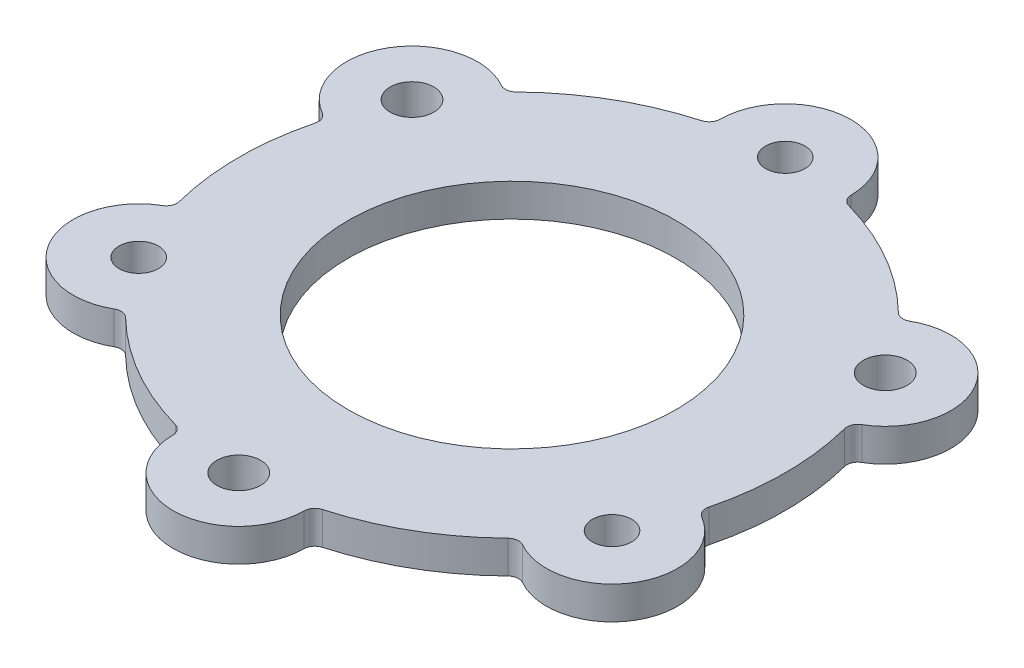
ISO-10303-21;
HEADER;
FILE_DESCRIPTION(('STEP AP214'),'2;1');
FILE_NAME('part.step','',(''),(''),'','','');
FILE_SCHEMA(('AUTOMOTIVE_DESIGN { 1 0 10303 214 1 1 1 1 }'));
ENDSEC;
DATA;
#1=APPLICATION_CONTEXT('core data for automotive mechanical design processes');
#2=APPLICATION_PROTOCOL_DEFINITION('international standard','automotive_design',2000,#1);
#3=PRODUCT_CONTEXT('',#1,'mechanical');
#4=PRODUCT('Part','Part','',(#3));
#5=PRODUCT_RELATED_PRODUCT_CATEGORY('part','',(#4));
#6=PRODUCT_DEFINITION_FORMATION('','',#4);
#7=PRODUCT_DEFINITION_CONTEXT('part definition',#1,'design');
#8=PRODUCT_DEFINITION('design','',#6,#7);
#9=PRODUCT_DEFINITION_SHAPE('','',#8);
#10=(LENGTH_UNIT() NAMED_UNIT(*) SI_UNIT(.MILLI.,.METRE.));
#11=(NAMED_UNIT(*) PLANE_ANGLE_UNIT() SI_UNIT($,.RADIAN.));
#12=(NAMED_UNIT(*) SI_UNIT($,.STERADIAN.) SOLID_ANGLE_UNIT());
#13=UNCERTAINTY_MEASURE_WITH_UNIT(LENGTH_MEASURE(1.E-05),#10,'distance_accuracy_value','');
#14=(GEOMETRIC_REPRESENTATION_CONTEXT(3) GLOBAL_UNCERTAINTY_ASSIGNED_CONTEXT((#13)) GLOBAL_UNIT_ASSIGNED_CONTEXT((#10,
#11,#12)) REPRESENTATION_CONTEXT('',''));
#15=CARTESIAN_POINT('',(0.,0.,0.));
#16=DIRECTION('',(0.,0.,1.));
#17=DIRECTION('',(1.,0.,0.));
#18=AXIS2_PLACEMENT_3D('',#15,#16,#17);
#19=CARTESIAN_POINT('',(0.,1.5,0.));
#20=DIRECTION('',(0.,-1.,0.));
#21=DIRECTION('',(0.,0.,-1.));
#22=AXIS2_PLACEMENT_3D('',#19,#20,#21);
#23=CYLINDRICAL_SURFACE('',#22,12.5);
#24=CARTESIAN_POINT('',(0.,1.5,0.));
#25=DIRECTION('',(0.,1.,0.));
#26=DIRECTION('',(0.,0.,1.));
#27=AXIS2_PLACEMENT_3D('',#24,#25,#26);
#28=CIRCLE('',#27,12.5);
#29=CARTESIAN_POINT('',(-3.36532966988113,1.5,-12.0384615384615));
#30=VERTEX_POINT('',#29);
#31=CARTESIAN_POINT('',(-8.74294867984902,1.5,-8.93369175545733));
#32=VERTEX_POINT('',#31);
#33=EDGE_CURVE('E502',#30,#32,#28,.T.);
#34=ORIENTED_EDGE('',*,*,#33,.F.);
#35=DIRECTION('',(0.,-1.,0.));
#36=VECTOR('',#35,1.);
#37=CARTESIAN_POINT('',(-3.36532966988113,1.5,-12.0384615384615));
#38=LINE('',#37,#36);
#39=CARTESIAN_POINT('',(-3.36532966988113,0.,-12.0384615384615));
#40=VERTEX_POINT('',#39);
#41=EDGE_CURVE('E305',#30,#40,#38,.T.);
#42=ORIENTED_EDGE('',*,*,#41,.T.);
#43=CARTESIAN_POINT('',(0.,0.,0.));
#44=DIRECTION('',(0.,1.,0.));
#45=DIRECTION('',(0.,0.,1.));
#46=AXIS2_PLACEMENT_3D('',#43,#44,#45);
#47=CIRCLE('',#46,12.5);
#48=CARTESIAN_POINT('',(-8.74294867984902,0.,-8.93369175545733));
#49=VERTEX_POINT('',#48);
#50=EDGE_CURVE('E418',#40,#49,#47,.T.);
#51=ORIENTED_EDGE('',*,*,#50,.T.);
#52=DIRECTION('',(0.,-1.,0.));
#53=VECTOR('',#52,1.);
#54=CARTESIAN_POINT('',(-8.74294867984902,1.5,-8.93369175545733));
#55=LINE('',#54,#53);
#56=EDGE_CURVE('E303',#49,#32,#55,.F.);
#57=ORIENTED_EDGE('',*,*,#56,.T.);
#58=EDGE_LOOP('',(#34,#42,#51,#57));
#59=FACE_BOUND('',#58,.T.);
#60=ADVANCED_FACE('F34',(#59),#23,.T.);
#61=CARTESIAN_POINT('',(-10.8253175473055,1.5,-6.25000000000001));
#62=DIRECTION('',(0.,-1.,0.));
#63=DIRECTION('',(0.,0.,-1.));
#64=AXIS2_PLACEMENT_3D('',#61,#62,#63);
#65=CYLINDRICAL_SURFACE('',#64,3.);
#66=CARTESIAN_POINT('',(-10.8253175473055,1.5,-6.25000000000001));
#67=DIRECTION('',(0.,1.,0.));
#68=DIRECTION('',(0.,0.,1.));
#69=AXIS2_PLACEMENT_3D('',#66,#67,#68);
#70=CIRCLE('',#69,3.);
#71=CARTESIAN_POINT('',(-9.34018818708049,1.5,-8.85660522200768));
#72=VERTEX_POINT('',#71);
#73=CARTESIAN_POINT('',(-12.3401392070888,1.5,-3.66053763513518));
#74=VERTEX_POINT('',#73);
#75=EDGE_CURVE('E500',#72,#74,#70,.T.);
#76=ORIENTED_EDGE('',*,*,#75,.F.);
#77=DIRECTION('',(0.,-1.,0.));
#78=VECTOR('',#77,1.);
#79=CARTESIAN_POINT('',(-9.34018818708049,1.5,-8.85660522200768));
#80=LINE('',#79,#78);
#81=CARTESIAN_POINT('',(-9.34018818708049,0.,-8.85660522200768));
#82=VERTEX_POINT('',#81);
#83=EDGE_CURVE('E310',#72,#82,#80,.T.);
#84=ORIENTED_EDGE('',*,*,#83,.T.);
#85=CARTESIAN_POINT('',(-10.8253175473055,0.,-6.25000000000001));
#86=DIRECTION('',(0.,1.,0.));
#87=DIRECTION('',(0.,0.,1.));
#88=AXIS2_PLACEMENT_3D('',#85,#86,#87);
#89=CIRCLE('',#88,3.);
#90=CARTESIAN_POINT('',(-12.3401392070888,0.,-3.66053763513518));
#91=VERTEX_POINT('',#90);
#92=EDGE_CURVE('E421',#82,#91,#89,.T.);
#93=ORIENTED_EDGE('',*,*,#92,.T.);
#94=DIRECTION('',(0.,-1.,0.));
#95=VECTOR('',#94,1.);
#96=CARTESIAN_POINT('',(-12.3401392070888,1.5,-3.66053763513518));
#97=LINE('',#96,#95);
#98=EDGE_CURVE('E308',#91,#74,#97,.F.);
#99=ORIENTED_EDGE('',*,*,#98,.T.);
#100=EDGE_LOOP('',(#76,#84,#93,#99));
#101=FACE_BOUND('',#100,.T.);
#102=ADVANCED_FACE('F443',(#101),#65,.T.);
#103=CARTESIAN_POINT('',(0.,1.5,0.));
#104=DIRECTION('',(0.,-1.,0.));
#105=DIRECTION('',(0.,0.,-1.));
#106=AXIS2_PLACEMENT_3D('',#103,#104,#105);
#107=CYLINDRICAL_SURFACE('',#106,12.5);
#108=CARTESIAN_POINT('',(0.,1.5,0.));
#109=DIRECTION('',(0.,1.,0.));
#110=DIRECTION('',(0.,0.,1.));
#111=AXIS2_PLACEMENT_3D('',#108,#109,#110);
#112=CIRCLE('',#111,12.5);
#113=CARTESIAN_POINT('',(-12.1082783497302,1.5,-3.1047697830042));
#114=VERTEX_POINT('',#113);
#115=CARTESIAN_POINT('',(-12.1082783497302,1.5,3.10476978300421));
#116=VERTEX_POINT('',#115);
#117=EDGE_CURVE('E378',#114,#116,#112,.T.);
#118=ORIENTED_EDGE('',*,*,#117,.F.);
#119=DIRECTION('',(0.,-1.,0.));
#120=VECTOR('',#119,1.);
#121=CARTESIAN_POINT('',(-12.1082783497302,1.5,-3.1047697830042));
#122=LINE('',#121,#120);
#123=CARTESIAN_POINT('',(-12.1082783497302,0.,-3.1047697830042));
#124=VERTEX_POINT('',#123);
#125=EDGE_CURVE('E315',#114,#124,#122,.T.);
#126=ORIENTED_EDGE('',*,*,#125,.T.);
#127=CARTESIAN_POINT('',(0.,0.,0.));
#128=DIRECTION('',(0.,1.,0.));
#129=DIRECTION('',(0.,0.,1.));
#130=AXIS2_PLACEMENT_3D('',#127,#128,#129);
#131=CIRCLE('',#130,12.5);
#132=CARTESIAN_POINT('',(-12.1082783497302,0.,3.10476978300421));
#133=VERTEX_POINT('',#132);
#134=EDGE_CURVE('E364',#124,#133,#131,.T.);
#135=ORIENTED_EDGE('',*,*,#134,.T.);
#136=DIRECTION('',(0.,-1.,0.));
#137=VECTOR('',#136,1.);
#138=CARTESIAN_POINT('',(-12.1082783497302,1.5,3.10476978300421));
#139=LINE('',#138,#137);
#140=EDGE_CURVE('E313',#133,#116,#139,.F.);
#141=ORIENTED_EDGE('',*,*,#140,.T.);
#142=EDGE_LOOP('',(#118,#126,#135,#141));
#143=FACE_BOUND('',#142,.T.);
#144=ADVANCED_FACE('F429',(#143),#107,.T.);
#145=CARTESIAN_POINT('',(-10.8253175473055,1.5,6.25000000000001));
#146=DIRECTION('',(0.,-1.,0.));
#147=DIRECTION('',(0.,0.,-1.));
#148=AXIS2_PLACEMENT_3D('',#145,#146,#147);
#149=CYLINDRICAL_SURFACE('',#148,3.);
#150=CARTESIAN_POINT('',(-10.8253175473055,1.5,6.25000000000001));
#151=DIRECTION('',(0.,1.,0.));
#152=DIRECTION('',(0.,0.,1.));
#153=AXIS2_PLACEMENT_3D('',#150,#151,#152);
#154=CIRCLE('',#153,3.);
#155=CARTESIAN_POINT('',(-12.3401392070888,1.5,3.66053763513518));
#156=VERTEX_POINT('',#155);
#157=CARTESIAN_POINT('',(-9.34018818708048,1.5,8.85660522200768));
#158=VERTEX_POINT('',#157);
#159=EDGE_CURVE('E372',#156,#158,#154,.T.);
#160=ORIENTED_EDGE('',*,*,#159,.F.);
#161=DIRECTION('',(0.,-1.,0.));
#162=VECTOR('',#161,1.);
#163=CARTESIAN_POINT('',(-12.3401392070888,1.5,3.66053763513518));
#164=LINE('',#163,#162);
#165=CARTESIAN_POINT('',(-12.3401392070888,0.,3.66053763513518));
#166=VERTEX_POINT('',#165);
#167=EDGE_CURVE('E207',#156,#166,#164,.T.);
#168=ORIENTED_EDGE('',*,*,#167,.T.);
#169=CARTESIAN_POINT('',(-10.8253175473055,0.,6.25000000000001));
#170=DIRECTION('',(0.,1.,0.));
#171=DIRECTION('',(0.,0.,1.));
#172=AXIS2_PLACEMENT_3D('',#169,#170,#171);
#173=CIRCLE('',#172,3.);
#174=CARTESIAN_POINT('',(-9.34018818708048,0.,8.85660522200768));
#175=VERTEX_POINT('',#174);
#176=EDGE_CURVE('E231',#166,#175,#173,.T.);
#177=ORIENTED_EDGE('',*,*,#176,.T.);
#178=DIRECTION('',(0.,-1.,0.));
#179=VECTOR('',#178,1.);
#180=CARTESIAN_POINT('',(-9.34018818708048,1.5,8.85660522200768));
#181=LINE('',#180,#179);
#182=EDGE_CURVE('E49',#175,#158,#181,.F.);
#183=ORIENTED_EDGE('',*,*,#182,.T.);
#184=EDGE_LOOP('',(#160,#168,#177,#183));
#185=FACE_BOUND('',#184,.T.);
#186=ADVANCED_FACE('F362',(#185),#149,.T.);
#187=CARTESIAN_POINT('',(0.,1.5,0.));
#188=DIRECTION('',(0.,-1.,0.));
#189=DIRECTION('',(0.,0.,-1.));
#190=AXIS2_PLACEMENT_3D('',#187,#188,#189);
#191=CYLINDRICAL_SURFACE('',#190,12.5);
#192=CARTESIAN_POINT('',(0.,0.,0.));
#193=DIRECTION('',(0.,1.,0.));
#194=DIRECTION('',(0.,0.,1.));
#195=AXIS2_PLACEMENT_3D('',#192,#193,#194);
#196=CIRCLE('',#195,12.5);
#197=CARTESIAN_POINT('',(-8.74294867984902,0.,8.93369175545733));
#198=VERTEX_POINT('',#197);
#199=CARTESIAN_POINT('',(-3.36532966988114,0.,12.0384615384615));
#200=VERTEX_POINT('',#199);
#201=EDGE_CURVE('E226',#198,#200,#196,.T.);
#202=ORIENTED_EDGE('',*,*,#201,.T.);
#203=DIRECTION('',(0.,-1.,0.));
#204=VECTOR('',#203,1.);
#205=CARTESIAN_POINT('',(-3.36532966988114,1.5,12.0384615384615));
#206=LINE('',#205,#204);
#207=CARTESIAN_POINT('',(-3.36532966988114,1.5,12.0384615384615));
#208=VERTEX_POINT('',#207);
#209=EDGE_CURVE('E201',#200,#208,#206,.F.);
#210=ORIENTED_EDGE('',*,*,#209,.T.);
#211=CARTESIAN_POINT('',(0.,1.5,0.));
#212=DIRECTION('',(0.,1.,0.));
#213=DIRECTION('',(0.,0.,1.));
#214=AXIS2_PLACEMENT_3D('',#211,#212,#213);
#215=CIRCLE('',#214,12.5);
#216=CARTESIAN_POINT('',(-8.74294867984902,1.5,8.93369175545733));
#217=VERTEX_POINT('',#216);
#218=EDGE_CURVE('E371',#217,#208,#215,.T.);
#219=ORIENTED_EDGE('',*,*,#218,.F.);
#220=DIRECTION('',(0.,-1.,0.));
#221=VECTOR('',#220,1.);
#222=CARTESIAN_POINT('',(-8.74294867984902,1.5,8.93369175545733));
#223=LINE('',#222,#221);
#224=EDGE_CURVE('E217',#217,#198,#223,.T.);
#225=ORIENTED_EDGE('',*,*,#224,.T.);
#226=EDGE_LOOP('',(#202,#210,#219,#225));
#227=FACE_BOUND('',#226,.T.);
#228=ADVANCED_FACE('F374',(#227),#191,.T.);
#229=CARTESIAN_POINT('',(0.,1.5,12.5));
#230=DIRECTION('',(0.,-1.,0.));
#231=DIRECTION('',(0.,0.,-1.));
#232=AXIS2_PLACEMENT_3D('',#229,#230,#231);
#233=CYLINDRICAL_SURFACE('',#232,3.);
#234=CARTESIAN_POINT('',(0.,1.5,12.5));
#235=DIRECTION('',(0.,1.,0.));
#236=DIRECTION('',(0.,0.,1.));
#237=AXIS2_PLACEMENT_3D('',#234,#235,#236);
#238=CIRCLE('',#237,3.);
#239=CARTESIAN_POINT('',(-2.99995102000833,1.5,12.5171428571429));
#240=VERTEX_POINT('',#239);
#241=CARTESIAN_POINT('',(2.99995102000832,1.5,12.5171428571429));
#242=VERTEX_POINT('',#241);
#243=EDGE_CURVE('E216',#240,#242,#238,.T.);
#244=ORIENTED_EDGE('',*,*,#243,.F.);
#245=DIRECTION('',(0.,-1.,0.));
#246=VECTOR('',#245,1.);
#247=CARTESIAN_POINT('',(-2.99995102000833,1.5,12.5171428571429));
#248=LINE('',#247,#246);
#249=CARTESIAN_POINT('',(-2.99995102000833,0.,12.5171428571429));
#250=VERTEX_POINT('',#249);
#251=EDGE_CURVE('E200',#240,#250,#248,.T.);
#252=ORIENTED_EDGE('',*,*,#251,.T.);
#253=CARTESIAN_POINT('',(0.,0.,12.5));
#254=DIRECTION('',(0.,1.,0.));
#255=DIRECTION('',(0.,0.,1.));
#256=AXIS2_PLACEMENT_3D('',#253,#254,#255);
#257=CIRCLE('',#256,3.);
#258=CARTESIAN_POINT('',(2.99995102000832,0.,12.5171428571429));
#259=VERTEX_POINT('',#258);
#260=EDGE_CURVE('E213',#250,#259,#257,.T.);
#261=ORIENTED_EDGE('',*,*,#260,.T.);
#262=DIRECTION('',(0.,-1.,0.));
#263=VECTOR('',#262,1.);
#264=CARTESIAN_POINT('',(2.99995102000832,1.5,12.5171428571429));
#265=LINE('',#264,#263);
#266=EDGE_CURVE('E218',#259,#242,#265,.F.);
#267=ORIENTED_EDGE('',*,*,#266,.T.);
#268=EDGE_LOOP('',(#244,#252,#261,#267));
#269=FACE_BOUND('',#268,.T.);
#270=ADVANCED_FACE('F212',(#269),#233,.T.);
#271=CARTESIAN_POINT('',(0.,1.5,0.));
#272=DIRECTION('',(0.,-1.,0.));
#273=DIRECTION('',(0.,0.,-1.));
#274=AXIS2_PLACEMENT_3D('',#271,#272,#273);
#275=CYLINDRICAL_SURFACE('',#274,12.5);
#276=CARTESIAN_POINT('',(0.,1.5,0.));
#277=DIRECTION('',(0.,1.,0.));
#278=DIRECTION('',(0.,0.,1.));
#279=AXIS2_PLACEMENT_3D('',#276,#277,#278);
#280=CIRCLE('',#279,12.5);
#281=CARTESIAN_POINT('',(3.36532966988113,1.5,12.0384615384615));
#282=VERTEX_POINT('',#281);
#283=CARTESIAN_POINT('',(8.74294867984903,1.5,8.93369175545733));
#284=VERTEX_POINT('',#283);
#285=EDGE_CURVE('E376',#282,#284,#280,.T.);
#286=ORIENTED_EDGE('',*,*,#285,.F.);
#287=DIRECTION('',(0.,-1.,0.));
#288=VECTOR('',#287,1.);
#289=CARTESIAN_POINT('',(3.36532966988113,1.5,12.0384615384615));
#290=LINE('',#289,#288);
#291=CARTESIAN_POINT('',(3.36532966988113,0.,12.0384615384615));
#292=VERTEX_POINT('',#291);
#293=EDGE_CURVE('E275',#282,#292,#290,.T.);
#294=ORIENTED_EDGE('',*,*,#293,.T.);
#295=CARTESIAN_POINT('',(0.,0.,0.));
#296=DIRECTION('',(0.,1.,0.));
#297=DIRECTION('',(0.,0.,1.));
#298=AXIS2_PLACEMENT_3D('',#295,#296,#297);
#299=CIRCLE('',#298,12.5);
#300=CARTESIAN_POINT('',(8.74294867984903,0.,8.93369175545733));
#301=VERTEX_POINT('',#300);
#302=EDGE_CURVE('E225',#292,#301,#299,.T.);
#303=ORIENTED_EDGE('',*,*,#302,.T.);
#304=DIRECTION('',(0.,-1.,0.));
#305=VECTOR('',#304,1.);
#306=CARTESIAN_POINT('',(8.74294867984903,1.5,8.93369175545733));
#307=LINE('',#306,#305);
#308=EDGE_CURVE('E273',#301,#284,#307,.F.);
#309=ORIENTED_EDGE('',*,*,#308,.T.);
#310=EDGE_LOOP('',(#286,#294,#303,#309));
#311=FACE_BOUND('',#310,.T.);
#312=ADVANCED_FACE('F561',(#311),#275,.T.);
#313=CARTESIAN_POINT('',(10.8253175473055,1.5,6.25));
#314=DIRECTION('',(0.,-1.,0.));
#315=DIRECTION('',(0.,0.,-1.));
#316=AXIS2_PLACEMENT_3D('',#313,#314,#315);
#317=CYLINDRICAL_SURFACE('',#316,3.00000000000001);
#318=CARTESIAN_POINT('',(10.8253175473055,1.5,6.25));
#319=DIRECTION('',(0.,1.,0.));
#320=DIRECTION('',(0.,0.,1.));
#321=AXIS2_PLACEMENT_3D('',#318,#319,#320);
#322=CIRCLE('',#321,3.00000000000001);
#323=CARTESIAN_POINT('',(9.34018818708049,1.5,8.85660522200767));
#324=VERTEX_POINT('',#323);
#325=CARTESIAN_POINT('',(12.3401392070888,1.5,3.66053763513517));
#326=VERTEX_POINT('',#325);
#327=EDGE_CURVE('E384',#324,#326,#322,.T.);
#328=ORIENTED_EDGE('',*,*,#327,.F.);
#329=DIRECTION('',(0.,-1.,0.));
#330=VECTOR('',#329,1.);
#331=CARTESIAN_POINT('',(9.34018818708049,1.5,8.85660522200768));
#332=LINE('',#331,#330);
#333=CARTESIAN_POINT('',(9.34018818708049,0.,8.85660522200767));
#334=VERTEX_POINT('',#333);
#335=EDGE_CURVE('E280',#324,#334,#332,.T.);
#336=ORIENTED_EDGE('',*,*,#335,.T.);
#337=CARTESIAN_POINT('',(10.8253175473055,0.,6.25));
#338=DIRECTION('',(0.,1.,0.));
#339=DIRECTION('',(0.,0.,1.));
#340=AXIS2_PLACEMENT_3D('',#337,#338,#339);
#341=CIRCLE('',#340,3.00000000000001);
#342=CARTESIAN_POINT('',(12.3401392070888,0.,3.66053763513517));
#343=VERTEX_POINT('',#342);
#344=EDGE_CURVE('E229',#334,#343,#341,.T.);
#345=ORIENTED_EDGE('',*,*,#344,.T.);
#346=DIRECTION('',(0.,-1.,0.));
#347=VECTOR('',#346,1.);
#348=CARTESIAN_POINT('',(12.3401392070888,1.5,3.66053763513517));
#349=LINE('',#348,#347);
#350=EDGE_CURVE('E278',#343,#326,#349,.F.);
#351=ORIENTED_EDGE('',*,*,#350,.T.);
#352=EDGE_LOOP('',(#328,#336,#345,#351));
#353=FACE_BOUND('',#352,.T.);
#354=ADVANCED_FACE('F557',(#353),#317,.T.);
#355=CARTESIAN_POINT('',(0.,1.5,0.));
#356=DIRECTION('',(0.,-1.,0.));
#357=DIRECTION('',(0.,0.,-1.));
#358=AXIS2_PLACEMENT_3D('',#355,#356,#357);
#359=CYLINDRICAL_SURFACE('',#358,12.5);
#360=CARTESIAN_POINT('',(0.,1.5,0.));
#361=DIRECTION('',(0.,1.,0.));
#362=DIRECTION('',(0.,0.,1.));
#363=AXIS2_PLACEMENT_3D('',#360,#361,#362);
#364=CIRCLE('',#363,12.5);
#365=CARTESIAN_POINT('',(12.1082783497302,1.5,3.1047697830042));
#366=VERTEX_POINT('',#365);
#367=CARTESIAN_POINT('',(12.1082783497302,1.5,-3.10476978300421));
#368=VERTEX_POINT('',#367);
#369=EDGE_CURVE('E387',#366,#368,#364,.T.);
#370=ORIENTED_EDGE('',*,*,#369,.F.);
#371=DIRECTION('',(0.,-1.,0.));
#372=VECTOR('',#371,1.);
#373=CARTESIAN_POINT('',(12.1082783497302,1.5,3.1047697830042));
#374=LINE('',#373,#372);
#375=CARTESIAN_POINT('',(12.1082783497302,0.,3.1047697830042));
#376=VERTEX_POINT('',#375);
#377=EDGE_CURVE('E285',#366,#376,#374,.T.);
#378=ORIENTED_EDGE('',*,*,#377,.T.);
#379=CARTESIAN_POINT('',(0.,0.,0.));
#380=DIRECTION('',(0.,1.,0.));
#381=DIRECTION('',(0.,0.,1.));
#382=AXIS2_PLACEMENT_3D('',#379,#380,#381);
#383=CIRCLE('',#382,12.5);
#384=CARTESIAN_POINT('',(12.1082783497302,0.,-3.10476978300421));
#385=VERTEX_POINT('',#384);
#386=EDGE_CURVE('E237',#376,#385,#383,.T.);
#387=ORIENTED_EDGE('',*,*,#386,.T.);
#388=DIRECTION('',(0.,-1.,0.));
#389=VECTOR('',#388,1.);
#390=CARTESIAN_POINT('',(12.1082783497302,1.5,-3.10476978300421));
#391=LINE('',#390,#389);
#392=EDGE_CURVE('E283',#385,#368,#391,.F.);
#393=ORIENTED_EDGE('',*,*,#392,.T.);
#394=EDGE_LOOP('',(#370,#378,#387,#393));
#395=FACE_BOUND('',#394,.T.);
#396=ADVANCED_FACE('F553',(#395),#359,.T.);
#397=CARTESIAN_POINT('',(10.8253175473055,1.5,-6.25000000000002));
#398=DIRECTION('',(0.,-1.,0.));
#399=DIRECTION('',(0.,0.,-1.));
#400=AXIS2_PLACEMENT_3D('',#397,#398,#399);
#401=CYLINDRICAL_SURFACE('',#400,3.);
#402=CARTESIAN_POINT('',(10.8253175473055,1.5,-6.25000000000002));
#403=DIRECTION('',(0.,1.,0.));
#404=DIRECTION('',(0.,0.,1.));
#405=AXIS2_PLACEMENT_3D('',#402,#403,#404);
#406=CIRCLE('',#405,3.);
#407=CARTESIAN_POINT('',(12.3401392070888,1.5,-3.66053763513519));
#408=VERTEX_POINT('',#407);
#409=CARTESIAN_POINT('',(9.34018818708048,1.5,-8.85660522200768));
#410=VERTEX_POINT('',#409);
#411=EDGE_CURVE('E390',#408,#410,#406,.T.);
#412=ORIENTED_EDGE('',*,*,#411,.F.);
#413=DIRECTION('',(0.,-1.,0.));
#414=VECTOR('',#413,1.);
#415=CARTESIAN_POINT('',(12.3401392070888,1.5,-3.66053763513519));
#416=LINE('',#415,#414);
#417=CARTESIAN_POINT('',(12.3401392070888,0.,-3.66053763513519));
#418=VERTEX_POINT('',#417);
#419=EDGE_CURVE('E290',#408,#418,#416,.T.);
#420=ORIENTED_EDGE('',*,*,#419,.T.);
#421=CARTESIAN_POINT('',(10.8253175473055,0.,-6.25000000000002));
#422=DIRECTION('',(0.,1.,0.));
#423=DIRECTION('',(0.,0.,1.));
#424=AXIS2_PLACEMENT_3D('',#421,#422,#423);
#425=CIRCLE('',#424,3.);
#426=CARTESIAN_POINT('',(9.34018818708048,0.,-8.85660522200768));
#427=VERTEX_POINT('',#426);
#428=EDGE_CURVE('E240',#418,#427,#425,.T.);
#429=ORIENTED_EDGE('',*,*,#428,.T.);
#430=DIRECTION('',(0.,-1.,0.));
#431=VECTOR('',#430,1.);
#432=CARTESIAN_POINT('',(9.34018818708048,1.5,-8.85660522200768));
#433=LINE('',#432,#431);
#434=EDGE_CURVE('E288',#427,#410,#433,.F.);
#435=ORIENTED_EDGE('',*,*,#434,.T.);
#436=EDGE_LOOP('',(#412,#420,#429,#435));
#437=FACE_BOUND('',#436,.T.);
#438=ADVANCED_FACE('F549',(#437),#401,.T.);
#439=CARTESIAN_POINT('',(0.,1.5,0.));
#440=DIRECTION('',(0.,-1.,0.));
#441=DIRECTION('',(0.,0.,-1.));
#442=AXIS2_PLACEMENT_3D('',#439,#440,#441);
#443=CYLINDRICAL_SURFACE('',#442,12.5);
#444=CARTESIAN_POINT('',(0.,1.5,0.));
#445=DIRECTION('',(0.,1.,0.));
#446=DIRECTION('',(0.,0.,1.));
#447=AXIS2_PLACEMENT_3D('',#444,#445,#446);
#448=CIRCLE('',#447,12.5);
#449=CARTESIAN_POINT('',(8.74294867984901,1.5,-8.93369175545734));
#450=VERTEX_POINT('',#449);
#451=CARTESIAN_POINT('',(3.36532966988113,1.5,-12.0384615384615));
#452=VERTEX_POINT('',#451);
#453=EDGE_CURVE('E393',#450,#452,#448,.T.);
#454=ORIENTED_EDGE('',*,*,#453,.F.);
#455=DIRECTION('',(0.,-1.,0.));
#456=VECTOR('',#455,1.);
#457=CARTESIAN_POINT('',(8.74294867984901,1.5,-8.93369175545734));
#458=LINE('',#457,#456);
#459=CARTESIAN_POINT('',(8.74294867984901,0.,-8.93369175545734));
#460=VERTEX_POINT('',#459);
#461=EDGE_CURVE('E295',#450,#460,#458,.T.);
#462=ORIENTED_EDGE('',*,*,#461,.T.);
#463=CARTESIAN_POINT('',(0.,0.,0.));
#464=DIRECTION('',(0.,1.,0.));
#465=DIRECTION('',(0.,0.,1.));
#466=AXIS2_PLACEMENT_3D('',#463,#464,#465);
#467=CIRCLE('',#466,12.5);
#468=CARTESIAN_POINT('',(3.36532966988113,0.,-12.0384615384615));
#469=VERTEX_POINT('',#468);
#470=EDGE_CURVE('E243',#460,#469,#467,.T.);
#471=ORIENTED_EDGE('',*,*,#470,.T.);
#472=DIRECTION('',(0.,-1.,0.));
#473=VECTOR('',#472,1.);
#474=CARTESIAN_POINT('',(3.36532966988113,1.5,-12.0384615384615));
#475=LINE('',#474,#473);
#476=EDGE_CURVE('E293',#469,#452,#475,.F.);
#477=ORIENTED_EDGE('',*,*,#476,.T.);
#478=EDGE_LOOP('',(#454,#462,#471,#477));
#479=FACE_BOUND('',#478,.T.);
#480=ADVANCED_FACE('F545',(#479),#443,.T.);
#481=CARTESIAN_POINT('',(0.,1.5,-12.5));
#482=DIRECTION('',(0.,-1.,0.));
#483=DIRECTION('',(0.,0.,-1.));
#484=AXIS2_PLACEMENT_3D('',#481,#482,#483);
#485=CYLINDRICAL_SURFACE('',#484,3.);
#486=CARTESIAN_POINT('',(0.,1.5,-12.5));
#487=DIRECTION('',(0.,1.,0.));
#488=DIRECTION('',(0.,0.,1.));
#489=AXIS2_PLACEMENT_3D('',#486,#487,#488);
#490=CIRCLE('',#489,3.);
#491=CARTESIAN_POINT('',(2.99995102000832,1.5,-12.5171428571429));
#492=VERTEX_POINT('',#491);
#493=CARTESIAN_POINT('',(-2.99995102000832,1.5,-12.5171428571429));
#494=VERTEX_POINT('',#493);
#495=EDGE_CURVE('E396',#492,#494,#490,.T.);
#496=ORIENTED_EDGE('',*,*,#495,.F.);
#497=DIRECTION('',(0.,-1.,0.));
#498=VECTOR('',#497,1.);
#499=CARTESIAN_POINT('',(2.99995102000832,1.5,-12.5171428571429));
#500=LINE('',#499,#498);
#501=CARTESIAN_POINT('',(2.99995102000832,0.,-12.5171428571429));
#502=VERTEX_POINT('',#501);
#503=EDGE_CURVE('E300',#492,#502,#500,.T.);
#504=ORIENTED_EDGE('',*,*,#503,.T.);
#505=CARTESIAN_POINT('',(0.,0.,-12.5));
#506=DIRECTION('',(0.,1.,0.));
#507=DIRECTION('',(0.,0.,1.));
#508=AXIS2_PLACEMENT_3D('',#505,#506,#507);
#509=CIRCLE('',#508,3.);
#510=CARTESIAN_POINT('',(-2.99995102000832,0.,-12.5171428571429));
#511=VERTEX_POINT('',#510);
#512=EDGE_CURVE('E246',#502,#511,#509,.T.);
#513=ORIENTED_EDGE('',*,*,#512,.T.);
#514=DIRECTION('',(0.,-1.,0.));
#515=VECTOR('',#514,1.);
#516=CARTESIAN_POINT('',(-2.99995102000832,1.5,-12.5171428571429));
#517=LINE('',#516,#515);
#518=EDGE_CURVE('E298',#511,#494,#517,.F.);
#519=ORIENTED_EDGE('',*,*,#518,.T.);
#520=EDGE_LOOP('',(#496,#504,#513,#519));
#521=FACE_BOUND('',#520,.T.);
#522=ADVANCED_FACE('F527',(#521),#485,.T.);
#523=CARTESIAN_POINT('',(10.825317547306,1.5,6.24999999999969));
#524=DIRECTION('',(0.,-1.,0.));
#525=DIRECTION('',(0.,0.,-1.));
#526=AXIS2_PLACEMENT_3D('',#523,#524,#525);
#527=CYLINDRICAL_SURFACE('',#526,0.900000000000476);
#528=CARTESIAN_POINT('',(10.825317547306,1.5,6.24999999999969));
#529=DIRECTION('',(0.,1.,0.));
#530=DIRECTION('',(0.,0.,1.));
#531=AXIS2_PLACEMENT_3D('',#528,#529,#530);
#532=CIRCLE('',#531,0.900000000000476);
#533=CARTESIAN_POINT('',(10.825317547306,1.5,7.15000000000017));
#534=VERTEX_POINT('',#533);
#535=EDGE_CURVE('E410',#534,#534,#532,.T.);
#536=ORIENTED_EDGE('',*,*,#535,.T.);
#537=EDGE_LOOP('',(#536));
#538=FACE_BOUND('',#537,.T.);
#539=CARTESIAN_POINT('',(10.825317547306,0.,6.24999999999969));
#540=DIRECTION('',(0.,1.,0.));
#541=DIRECTION('',(0.,0.,1.));
#542=AXIS2_PLACEMENT_3D('',#539,#540,#541);
#543=CIRCLE('',#542,0.900000000000476);
#544=CARTESIAN_POINT('',(10.825317547306,0.,7.15000000000017));
#545=VERTEX_POINT('',#544);
#546=EDGE_CURVE('E261',#545,#545,#543,.T.);
#547=ORIENTED_EDGE('',*,*,#546,.F.);
#548=EDGE_LOOP('',(#547));
#549=FACE_BOUND('',#548,.T.);
#550=ADVANCED_FACE('F523',(#538,#549),#527,.F.);
#551=CARTESIAN_POINT('',(10.8253175473055,1.5,-6.25000000000002));
#552=DIRECTION('',(0.,-1.,0.));
#553=DIRECTION('',(0.,0.,-1.));
#554=AXIS2_PLACEMENT_3D('',#551,#552,#553);
#555=CYLINDRICAL_SURFACE('',#554,1.);
#556=CARTESIAN_POINT('',(10.8253175473055,1.5,-6.25000000000002));
#557=DIRECTION('',(0.,1.,0.));
#558=DIRECTION('',(0.,0.,1.));
#559=AXIS2_PLACEMENT_3D('',#556,#557,#558);
#560=CIRCLE('',#559,1.);
#561=CARTESIAN_POINT('',(10.8253175473055,1.5,-5.25000000000001));
#562=VERTEX_POINT('',#561);
#563=EDGE_CURVE('E407',#562,#562,#560,.T.);
#564=ORIENTED_EDGE('',*,*,#563,.T.);
#565=EDGE_LOOP('',(#564));
#566=FACE_BOUND('',#565,.T.);
#567=CARTESIAN_POINT('',(10.8253175473055,0.,-6.25000000000002));
#568=DIRECTION('',(0.,1.,0.));
#569=DIRECTION('',(0.,0.,1.));
#570=AXIS2_PLACEMENT_3D('',#567,#568,#569);
#571=CIRCLE('',#570,1.);
#572=CARTESIAN_POINT('',(10.8253175473055,0.,-5.25000000000001));
#573=VERTEX_POINT('',#572);
#574=EDGE_CURVE('E258',#573,#573,#571,.T.);
#575=ORIENTED_EDGE('',*,*,#574,.F.);
#576=EDGE_LOOP('',(#575));
#577=FACE_BOUND('',#576,.T.);
#578=ADVANCED_FACE('F526',(#566,#577),#555,.F.);
#579=CARTESIAN_POINT('',(-10.825317547305,1.5,6.25000000000031));
#580=DIRECTION('',(0.,-1.,0.));
#581=DIRECTION('',(0.,0.,-1.));
#582=AXIS2_PLACEMENT_3D('',#579,#580,#581);
#583=CYLINDRICAL_SURFACE('',#582,0.900000000000713);
#584=CARTESIAN_POINT('',(-10.825317547305,1.5,6.25000000000031));
#585=DIRECTION('',(0.,1.,0.));
#586=DIRECTION('',(0.,0.,1.));
#587=AXIS2_PLACEMENT_3D('',#584,#585,#586);
#588=CIRCLE('',#587,0.900000000000713);
#589=CARTESIAN_POINT('',(-10.825317547305,1.5,7.15000000000102));
#590=VERTEX_POINT('',#589);
#591=EDGE_CURVE('E404',#590,#590,#588,.T.);
#592=ORIENTED_EDGE('',*,*,#591,.T.);
#593=EDGE_LOOP('',(#592));
#594=FACE_BOUND('',#593,.T.);
#595=CARTESIAN_POINT('',(-10.825317547305,0.,6.25000000000031));
#596=DIRECTION('',(0.,1.,0.));
#597=DIRECTION('',(0.,0.,1.));
#598=AXIS2_PLACEMENT_3D('',#595,#596,#597);
#599=CIRCLE('',#598,0.900000000000713);
#600=CARTESIAN_POINT('',(-10.825317547305,0.,7.15000000000102));
#601=VERTEX_POINT('',#600);
#602=EDGE_CURVE('E255',#601,#601,#599,.T.);
#603=ORIENTED_EDGE('',*,*,#602,.F.);
#604=EDGE_LOOP('',(#603));
#605=FACE_BOUND('',#604,.T.);
#606=ADVANCED_FACE('F531',(#594,#605),#583,.F.);
#607=CARTESIAN_POINT('',(0.,1.5,-12.5));
#608=DIRECTION('',(0.,-1.,0.));
#609=DIRECTION('',(0.,0.,-1.));
#610=AXIS2_PLACEMENT_3D('',#607,#608,#609);
#611=CYLINDRICAL_SURFACE('',#610,0.9);
#612=CARTESIAN_POINT('',(0.,1.5,-12.5));
#613=DIRECTION('',(0.,1.,0.));
#614=DIRECTION('',(0.,0.,1.));
#615=AXIS2_PLACEMENT_3D('',#612,#613,#614);
#616=CIRCLE('',#615,0.9);
#617=CARTESIAN_POINT('',(0.,1.5,-11.6));
#618=VERTEX_POINT('',#617);
#619=EDGE_CURVE('E401',#618,#618,#616,.T.);
#620=ORIENTED_EDGE('',*,*,#619,.T.);
#621=EDGE_LOOP('',(#620));
#622=FACE_BOUND('',#621,.T.);
#623=CARTESIAN_POINT('',(0.,0.,-12.5));
#624=DIRECTION('',(0.,1.,0.));
#625=DIRECTION('',(0.,0.,1.));
#626=AXIS2_PLACEMENT_3D('',#623,#624,#625);
#627=CIRCLE('',#626,0.9);
#628=CARTESIAN_POINT('',(0.,0.,-11.6));
#629=VERTEX_POINT('',#628);
#630=EDGE_CURVE('E252',#629,#629,#627,.T.);
#631=ORIENTED_EDGE('',*,*,#630,.F.);
#632=EDGE_LOOP('',(#631));
#633=FACE_BOUND('',#632,.T.);
#634=ADVANCED_FACE('F535',(#622,#633),#611,.F.);
#635=CARTESIAN_POINT('',(0.,1.5,0.));
#636=DIRECTION('',(0.,-1.,0.));
#637=DIRECTION('',(0.,0.,-1.));
#638=AXIS2_PLACEMENT_3D('',#635,#636,#637);
#639=CYLINDRICAL_SURFACE('',#638,7.5);
#640=CARTESIAN_POINT('',(0.,1.5,0.));
#641=DIRECTION('',(0.,1.,0.));
#642=DIRECTION('',(0.,0.,1.));
#643=AXIS2_PLACEMENT_3D('',#640,#641,#642);
#644=CIRCLE('',#643,7.5);
#645=CARTESIAN_POINT('',(0.,1.5,7.5));
#646=VERTEX_POINT('',#645);
#647=EDGE_CURVE('E398',#646,#646,#644,.T.);
#648=ORIENTED_EDGE('',*,*,#647,.T.);
#649=EDGE_LOOP('',(#648));
#650=FACE_BOUND('',#649,.T.);
#651=CARTESIAN_POINT('',(0.,0.,0.));
#652=DIRECTION('',(0.,1.,0.));
#653=DIRECTION('',(0.,0.,1.));
#654=AXIS2_PLACEMENT_3D('',#651,#652,#653);
#655=CIRCLE('',#654,7.5);
#656=CARTESIAN_POINT('',(0.,0.,7.5));
#657=VERTEX_POINT('',#656);
#658=EDGE_CURVE('E249',#657,#657,#655,.T.);
#659=ORIENTED_EDGE('',*,*,#658,.F.);
#660=EDGE_LOOP('',(#659));
#661=FACE_BOUND('',#660,.T.);
#662=ADVANCED_FACE('F458',(#650,#661),#639,.F.);
#663=CARTESIAN_POINT('',(-10.8253175473055,1.5,-6.25000000000001));
#664=DIRECTION('',(0.,-1.,0.));
#665=DIRECTION('',(0.,0.,-1.));
#666=AXIS2_PLACEMENT_3D('',#663,#664,#665);
#667=CYLINDRICAL_SURFACE('',#666,1.);
#668=CARTESIAN_POINT('',(-10.8253175473055,1.5,-6.25000000000001));
#669=DIRECTION('',(0.,1.,0.));
#670=DIRECTION('',(0.,0.,1.));
#671=AXIS2_PLACEMENT_3D('',#668,#669,#670);
#672=CIRCLE('',#671,1.);
#673=CARTESIAN_POINT('',(-10.8253175473055,1.5,-5.25000000000001));
#674=VERTEX_POINT('',#673);
#675=EDGE_CURVE('E267',#674,#674,#672,.T.);
#676=ORIENTED_EDGE('',*,*,#675,.T.);
#677=EDGE_LOOP('',(#676));
#678=FACE_BOUND('',#677,.T.);
#679=CARTESIAN_POINT('',(-10.8253175473055,0.,-6.25000000000001));
#680=DIRECTION('',(0.,1.,0.));
#681=DIRECTION('',(0.,0.,1.));
#682=AXIS2_PLACEMENT_3D('',#679,#680,#681);
#683=CIRCLE('',#682,1.);
#684=CARTESIAN_POINT('',(-10.8253175473055,0.,-5.25000000000001));
#685=VERTEX_POINT('',#684);
#686=EDGE_CURVE('E415',#685,#685,#683,.T.);
#687=ORIENTED_EDGE('',*,*,#686,.F.);
#688=EDGE_LOOP('',(#687));
#689=FACE_BOUND('',#688,.T.);
#690=ADVANCED_FACE('F454',(#678,#689),#667,.F.);
#691=CARTESIAN_POINT('',(0.,1.5,12.5));
#692=DIRECTION('',(0.,-1.,0.));
#693=DIRECTION('',(0.,0.,-1.));
#694=AXIS2_PLACEMENT_3D('',#691,#692,#693);
#695=CYLINDRICAL_SURFACE('',#694,1.);
#696=CARTESIAN_POINT('',(0.,1.5,12.5));
#697=DIRECTION('',(0.,1.,0.));
#698=DIRECTION('',(0.,0.,1.));
#699=AXIS2_PLACEMENT_3D('',#696,#697,#698);
#700=CIRCLE('',#699,1.);
#701=CARTESIAN_POINT('',(0.,1.5,13.5));
#702=VERTEX_POINT('',#701);
#703=EDGE_CURVE('E268',#702,#702,#700,.T.);
#704=ORIENTED_EDGE('',*,*,#703,.T.);
#705=EDGE_LOOP('',(#704));
#706=FACE_BOUND('',#705,.T.);
#707=CARTESIAN_POINT('',(0.,0.,12.5));
#708=DIRECTION('',(0.,1.,0.));
#709=DIRECTION('',(0.,0.,1.));
#710=AXIS2_PLACEMENT_3D('',#707,#708,#709);
#711=CIRCLE('',#710,1.);
#712=CARTESIAN_POINT('',(0.,0.,13.5));
#713=VERTEX_POINT('',#712);
#714=EDGE_CURVE('E264',#713,#713,#711,.T.);
#715=ORIENTED_EDGE('',*,*,#714,.F.);
#716=EDGE_LOOP('',(#715));
#717=FACE_BOUND('',#716,.T.);
#718=ADVANCED_FACE('F457',(#706,#717),#695,.F.);
#719=CARTESIAN_POINT('',(0.,1.5,0.));
#720=DIRECTION('',(0.,1.,0.));
#721=DIRECTION('',(0.,0.,1.));
#722=AXIS2_PLACEMENT_3D('',#719,#720,#721);
#723=PLANE('',#722);
#724=ORIENTED_EDGE('',*,*,#675,.F.);
#725=EDGE_LOOP('',(#724));
#726=FACE_BOUND('',#725,.T.);
#727=ORIENTED_EDGE('',*,*,#495,.T.);
#728=CARTESIAN_POINT('',(-3.49994285667637,1.5,-12.52));
#729=DIRECTION('',(0.,1.,0.));
#730=DIRECTION('',(0.,0.,1.));
#731=AXIS2_PLACEMENT_3D('',#728,#729,#730);
#732=CIRCLE('',#731,0.5);
#733=EDGE_CURVE('E347',#494,#30,#732,.F.);
#734=ORIENTED_EDGE('',*,*,#733,.T.);
#735=ORIENTED_EDGE('',*,*,#33,.T.);
#736=CARTESIAN_POINT('',(-9.09266662704298,1.5,-9.29103942567562));
#737=DIRECTION('',(0.,1.,0.));
#738=DIRECTION('',(0.,0.,1.));
#739=AXIS2_PLACEMENT_3D('',#736,#737,#738);
#740=CIRCLE('',#739,0.5);
#741=EDGE_CURVE('E351',#32,#72,#740,.F.);
#742=ORIENTED_EDGE('',*,*,#741,.T.);
#743=ORIENTED_EDGE('',*,*,#75,.T.);
#744=CARTESIAN_POINT('',(-12.5926094837194,1.5,-3.22896057432437));
#745=DIRECTION('',(0.,1.,0.));
#746=DIRECTION('',(0.,0.,1.));
#747=AXIS2_PLACEMENT_3D('',#744,#745,#746);
#748=CIRCLE('',#747,0.5);
#749=EDGE_CURVE('E355',#74,#114,#748,.F.);
#750=ORIENTED_EDGE('',*,*,#749,.T.);
#751=ORIENTED_EDGE('',*,*,#117,.T.);
#752=CARTESIAN_POINT('',(-12.5926094837194,1.5,3.22896057432438));
#753=DIRECTION('',(0.,1.,0.));
#754=DIRECTION('',(0.,0.,1.));
#755=AXIS2_PLACEMENT_3D('',#752,#753,#754);
#756=CIRCLE('',#755,0.5);
#757=EDGE_CURVE('E56',#116,#156,#756,.F.);
#758=ORIENTED_EDGE('',*,*,#757,.T.);
#759=ORIENTED_EDGE('',*,*,#159,.T.);
#760=CARTESIAN_POINT('',(-9.09266662704298,1.5,9.29103942567563));
#761=DIRECTION('',(0.,1.,0.));
#762=DIRECTION('',(0.,0.,1.));
#763=AXIS2_PLACEMENT_3D('',#760,#761,#762);
#764=CIRCLE('',#763,0.5);
#765=EDGE_CURVE('E11',#158,#217,#764,.F.);
#766=ORIENTED_EDGE('',*,*,#765,.T.);
#767=ORIENTED_EDGE('',*,*,#218,.T.);
#768=CARTESIAN_POINT('',(-3.49994285667638,1.5,12.52));
#769=DIRECTION('',(0.,1.,0.));
#770=DIRECTION('',(0.,0.,1.));
#771=AXIS2_PLACEMENT_3D('',#768,#769,#770);
#772=CIRCLE('',#771,0.5);
#773=EDGE_CURVE('E206',#208,#240,#772,.F.);
#774=ORIENTED_EDGE('',*,*,#773,.T.);
#775=ORIENTED_EDGE('',*,*,#243,.T.);
#776=CARTESIAN_POINT('',(3.49994285667638,1.5,12.52));
#777=DIRECTION('',(0.,1.,0.));
#778=DIRECTION('',(0.,0.,1.));
#779=AXIS2_PLACEMENT_3D('',#776,#777,#778);
#780=CIRCLE('',#779,0.5);
#781=EDGE_CURVE('E323',#242,#282,#780,.F.);
#782=ORIENTED_EDGE('',*,*,#781,.T.);
#783=ORIENTED_EDGE('',*,*,#285,.T.);
#784=CARTESIAN_POINT('',(9.09266662704299,1.5,9.29103942567562));
#785=DIRECTION('',(0.,1.,0.));
#786=DIRECTION('',(0.,0.,1.));
#787=AXIS2_PLACEMENT_3D('',#784,#785,#786);
#788=CIRCLE('',#787,0.5);
#789=EDGE_CURVE('E327',#284,#324,#788,.F.);
#790=ORIENTED_EDGE('',*,*,#789,.T.);
#791=ORIENTED_EDGE('',*,*,#327,.T.);
#792=CARTESIAN_POINT('',(12.5926094837194,1.5,3.22896057432436));
#793=DIRECTION('',(0.,1.,0.));
#794=DIRECTION('',(0.,0.,1.));
#795=AXIS2_PLACEMENT_3D('',#792,#793,#794);
#796=CIRCLE('',#795,0.5);
#797=EDGE_CURVE('E331',#326,#366,#796,.F.);
#798=ORIENTED_EDGE('',*,*,#797,.T.);
#799=ORIENTED_EDGE('',*,*,#369,.T.);
#800=CARTESIAN_POINT('',(12.5926094837194,1.5,-3.22896057432438));
#801=DIRECTION('',(0.,1.,0.));
#802=DIRECTION('',(0.,0.,1.));
#803=AXIS2_PLACEMENT_3D('',#800,#801,#802);
#804=CIRCLE('',#803,0.5);
#805=EDGE_CURVE('E335',#368,#408,#804,.F.);
#806=ORIENTED_EDGE('',*,*,#805,.T.);
#807=ORIENTED_EDGE('',*,*,#411,.T.);
#808=CARTESIAN_POINT('',(9.09266662704298,1.5,-9.29103942567563));
#809=DIRECTION('',(0.,1.,0.));
#810=DIRECTION('',(0.,0.,1.));
#811=AXIS2_PLACEMENT_3D('',#808,#809,#810);
#812=CIRCLE('',#811,0.5);
#813=EDGE_CURVE('E339',#410,#450,#812,.F.);
#814=ORIENTED_EDGE('',*,*,#813,.T.);
#815=ORIENTED_EDGE('',*,*,#453,.T.);
#816=CARTESIAN_POINT('',(3.49994285667637,1.5,-12.52));
#817=DIRECTION('',(0.,1.,0.));
#818=DIRECTION('',(0.,0.,1.));
#819=AXIS2_PLACEMENT_3D('',#816,#817,#818);
#820=CIRCLE('',#819,0.5);
#821=EDGE_CURVE('E343',#452,#492,#820,.F.);
#822=ORIENTED_EDGE('',*,*,#821,.T.);
#823=EDGE_LOOP('',(#727,#734,#735,#742,#743,#750,#751,#758,#759,#766,#767,#774,#775,#782,#783,
#790,#791,#798,#799,#806,#807,#814,#815,#822));
#824=FACE_BOUND('',#823,.T.);
#825=ORIENTED_EDGE('',*,*,#647,.F.);
#826=EDGE_LOOP('',(#825));
#827=FACE_BOUND('',#826,.T.);
#828=ORIENTED_EDGE('',*,*,#619,.F.);
#829=EDGE_LOOP('',(#828));
#830=FACE_BOUND('',#829,.T.);
#831=ORIENTED_EDGE('',*,*,#591,.F.);
#832=EDGE_LOOP('',(#831));
#833=FACE_BOUND('',#832,.T.);
#834=ORIENTED_EDGE('',*,*,#563,.F.);
#835=EDGE_LOOP('',(#834));
#836=FACE_BOUND('',#835,.T.);
#837=ORIENTED_EDGE('',*,*,#535,.F.);
#838=EDGE_LOOP('',(#837));
#839=FACE_BOUND('',#838,.T.);
#840=ORIENTED_EDGE('',*,*,#703,.F.);
#841=EDGE_LOOP('',(#840));
#842=FACE_BOUND('',#841,.T.);
#843=ADVANCED_FACE('F369',(#726,#824,#827,#830,#833,#836,#839,#842),#723,.T.);
#844=CARTESIAN_POINT('',(0.,0.,0.));
#845=DIRECTION('',(0.,1.,0.));
#846=DIRECTION('',(0.,0.,1.));
#847=AXIS2_PLACEMENT_3D('',#844,#845,#846);
#848=PLANE('',#847);
#849=ORIENTED_EDGE('',*,*,#686,.T.);
#850=EDGE_LOOP('',(#849));
#851=FACE_BOUND('',#850,.T.);
#852=ORIENTED_EDGE('',*,*,#50,.F.);
#853=CARTESIAN_POINT('',(-3.49994285667637,0.,-12.52));
#854=DIRECTION('',(0.,1.,0.));
#855=DIRECTION('',(0.,0.,1.));
#856=AXIS2_PLACEMENT_3D('',#853,#854,#855);
#857=CIRCLE('',#856,0.5);
#858=EDGE_CURVE('E345',#40,#511,#857,.T.);
#859=ORIENTED_EDGE('',*,*,#858,.T.);
#860=ORIENTED_EDGE('',*,*,#512,.F.);
#861=CARTESIAN_POINT('',(3.49994285667637,0.,-12.52));
#862=DIRECTION('',(0.,1.,0.));
#863=DIRECTION('',(0.,0.,1.));
#864=AXIS2_PLACEMENT_3D('',#861,#862,#863);
#865=CIRCLE('',#864,0.5);
#866=EDGE_CURVE('E341',#502,#469,#865,.T.);
#867=ORIENTED_EDGE('',*,*,#866,.T.);
#868=ORIENTED_EDGE('',*,*,#470,.F.);
#869=CARTESIAN_POINT('',(9.09266662704298,0.,-9.29103942567563));
#870=DIRECTION('',(0.,1.,0.));
#871=DIRECTION('',(0.,0.,1.));
#872=AXIS2_PLACEMENT_3D('',#869,#870,#871);
#873=CIRCLE('',#872,0.5);
#874=EDGE_CURVE('E337',#460,#427,#873,.T.);
#875=ORIENTED_EDGE('',*,*,#874,.T.);
#876=ORIENTED_EDGE('',*,*,#428,.F.);
#877=CARTESIAN_POINT('',(12.5926094837194,0.,-3.22896057432438));
#878=DIRECTION('',(0.,1.,0.));
#879=DIRECTION('',(0.,0.,1.));
#880=AXIS2_PLACEMENT_3D('',#877,#878,#879);
#881=CIRCLE('',#880,0.5);
#882=EDGE_CURVE('E333',#418,#385,#881,.T.);
#883=ORIENTED_EDGE('',*,*,#882,.T.);
#884=ORIENTED_EDGE('',*,*,#386,.F.);
#885=CARTESIAN_POINT('',(12.5926094837194,0.,3.22896057432436));
#886=DIRECTION('',(0.,1.,0.));
#887=DIRECTION('',(0.,0.,1.));
#888=AXIS2_PLACEMENT_3D('',#885,#886,#887);
#889=CIRCLE('',#888,0.5);
#890=EDGE_CURVE('E329',#376,#343,#889,.T.);
#891=ORIENTED_EDGE('',*,*,#890,.T.);
#892=ORIENTED_EDGE('',*,*,#344,.F.);
#893=CARTESIAN_POINT('',(9.09266662704299,0.,9.29103942567562));
#894=DIRECTION('',(0.,1.,0.));
#895=DIRECTION('',(0.,0.,1.));
#896=AXIS2_PLACEMENT_3D('',#893,#894,#895);
#897=CIRCLE('',#896,0.5);
#898=EDGE_CURVE('E325',#334,#301,#897,.T.);
#899=ORIENTED_EDGE('',*,*,#898,.T.);
#900=ORIENTED_EDGE('',*,*,#302,.F.);
#901=CARTESIAN_POINT('',(3.49994285667638,0.,12.52));
#902=DIRECTION('',(0.,1.,0.));
#903=DIRECTION('',(0.,0.,1.));
#904=AXIS2_PLACEMENT_3D('',#901,#902,#903);
#905=CIRCLE('',#904,0.5);
#906=EDGE_CURVE('E224',#292,#259,#905,.T.);
#907=ORIENTED_EDGE('',*,*,#906,.T.);
#908=ORIENTED_EDGE('',*,*,#260,.F.);
#909=CARTESIAN_POINT('',(-3.49994285667638,0.,12.52));
#910=DIRECTION('',(0.,1.,0.));
#911=DIRECTION('',(0.,0.,1.));
#912=AXIS2_PLACEMENT_3D('',#909,#910,#911);
#913=CIRCLE('',#912,0.5);
#914=EDGE_CURVE('E196',#250,#200,#913,.T.);
#915=ORIENTED_EDGE('',*,*,#914,.T.);
#916=ORIENTED_EDGE('',*,*,#201,.F.);
#917=CARTESIAN_POINT('',(-9.09266662704298,0.,9.29103942567563));
#918=DIRECTION('',(0.,1.,0.));
#919=DIRECTION('',(0.,0.,1.));
#920=AXIS2_PLACEMENT_3D('',#917,#918,#919);
#921=CIRCLE('',#920,0.5);
#922=EDGE_CURVE('E42',#198,#175,#921,.T.);
#923=ORIENTED_EDGE('',*,*,#922,.T.);
#924=ORIENTED_EDGE('',*,*,#176,.F.);
#925=CARTESIAN_POINT('',(-12.5926094837194,0.,3.22896057432438));
#926=DIRECTION('',(0.,1.,0.));
#927=DIRECTION('',(0.,0.,1.));
#928=AXIS2_PLACEMENT_3D('',#925,#926,#927);
#929=CIRCLE('',#928,0.5);
#930=EDGE_CURVE('E357',#166,#133,#929,.T.);
#931=ORIENTED_EDGE('',*,*,#930,.T.);
#932=ORIENTED_EDGE('',*,*,#134,.F.);
#933=CARTESIAN_POINT('',(-12.5926094837194,0.,-3.22896057432437));
#934=DIRECTION('',(0.,1.,0.));
#935=DIRECTION('',(0.,0.,1.));
#936=AXIS2_PLACEMENT_3D('',#933,#934,#935);
#937=CIRCLE('',#936,0.5);
#938=EDGE_CURVE('E353',#124,#91,#937,.T.);
#939=ORIENTED_EDGE('',*,*,#938,.T.);
#940=ORIENTED_EDGE('',*,*,#92,.F.);
#941=CARTESIAN_POINT('',(-9.09266662704298,0.,-9.29103942567562));
#942=DIRECTION('',(0.,1.,0.));
#943=DIRECTION('',(0.,0.,1.));
#944=AXIS2_PLACEMENT_3D('',#941,#942,#943);
#945=CIRCLE('',#944,0.5);
#946=EDGE_CURVE('E349',#82,#49,#945,.T.);
#947=ORIENTED_EDGE('',*,*,#946,.T.);
#948=EDGE_LOOP('',(#852,#859,#860,#867,#868,#875,#876,#883,#884,#891,#892,#899,#900,#907,#908,
#915,#916,#923,#924,#931,#932,#939,#940,#947));
#949=FACE_BOUND('',#948,.T.);
#950=ORIENTED_EDGE('',*,*,#658,.T.);
#951=EDGE_LOOP('',(#950));
#952=FACE_BOUND('',#951,.T.);
#953=ORIENTED_EDGE('',*,*,#630,.T.);
#954=EDGE_LOOP('',(#953));
#955=FACE_BOUND('',#954,.T.);
#956=ORIENTED_EDGE('',*,*,#602,.T.);
#957=EDGE_LOOP('',(#956));
#958=FACE_BOUND('',#957,.T.);
#959=ORIENTED_EDGE('',*,*,#574,.T.);
#960=EDGE_LOOP('',(#959));
#961=FACE_BOUND('',#960,.T.);
#962=ORIENTED_EDGE('',*,*,#546,.T.);
#963=EDGE_LOOP('',(#962));
#964=FACE_BOUND('',#963,.T.);
#965=ORIENTED_EDGE('',*,*,#714,.T.);
#966=EDGE_LOOP('',(#965));
#967=FACE_BOUND('',#966,.T.);
#968=ADVANCED_FACE('F221',(#851,#949,#952,#955,#958,#961,#964,#967),#848,.F.);
#969=CARTESIAN_POINT('',(-3.49994285667638,1.5,12.52));
#970=DIRECTION('',(0.,1.,0.));
#971=DIRECTION('',(0.,0.,1.));
#972=AXIS2_PLACEMENT_3D('',#969,#970,#971);
#973=CYLINDRICAL_SURFACE('',#972,0.5);
#974=ORIENTED_EDGE('',*,*,#773,.F.);
#975=ORIENTED_EDGE('',*,*,#209,.F.);
#976=ORIENTED_EDGE('',*,*,#914,.F.);
#977=ORIENTED_EDGE('',*,*,#251,.F.);
#978=EDGE_LOOP('',(#974,#975,#976,#977));
#979=FACE_BOUND('',#978,.T.);
#980=ADVANCED_FACE('F199',(#979),#973,.F.);
#981=CARTESIAN_POINT('',(3.49994285667638,1.5,12.52));
#982=DIRECTION('',(0.,1.,0.));
#983=DIRECTION('',(0.,0.,1.));
#984=AXIS2_PLACEMENT_3D('',#981,#982,#983);
#985=CYLINDRICAL_SURFACE('',#984,0.5);
#986=ORIENTED_EDGE('',*,*,#781,.F.);
#987=ORIENTED_EDGE('',*,*,#266,.F.);
#988=ORIENTED_EDGE('',*,*,#906,.F.);
#989=ORIENTED_EDGE('',*,*,#293,.F.);
#990=EDGE_LOOP('',(#986,#987,#988,#989));
#991=FACE_BOUND('',#990,.T.);
#992=ADVANCED_FACE('F462',(#991),#985,.F.);
#993=CARTESIAN_POINT('',(9.09266662704299,1.5,9.29103942567562));
#994=DIRECTION('',(0.,1.,0.));
#995=DIRECTION('',(0.,0.,1.));
#996=AXIS2_PLACEMENT_3D('',#993,#994,#995);
#997=CYLINDRICAL_SURFACE('',#996,0.5);
#998=ORIENTED_EDGE('',*,*,#789,.F.);
#999=ORIENTED_EDGE('',*,*,#308,.F.);
#1000=ORIENTED_EDGE('',*,*,#898,.F.);
#1001=ORIENTED_EDGE('',*,*,#335,.F.);
#1002=EDGE_LOOP('',(#998,#999,#1000,#1001));
#1003=FACE_BOUND('',#1002,.T.);
#1004=ADVANCED_FACE('F465',(#1003),#997,.F.);
#1005=CARTESIAN_POINT('',(12.5926094837194,1.5,3.22896057432436));
#1006=DIRECTION('',(0.,1.,0.));
#1007=DIRECTION('',(0.,0.,1.));
#1008=AXIS2_PLACEMENT_3D('',#1005,#1006,#1007);
#1009=CYLINDRICAL_SURFACE('',#1008,0.5);
#1010=ORIENTED_EDGE('',*,*,#797,.F.);
#1011=ORIENTED_EDGE('',*,*,#350,.F.);
#1012=ORIENTED_EDGE('',*,*,#890,.F.);
#1013=ORIENTED_EDGE('',*,*,#377,.F.);
#1014=EDGE_LOOP('',(#1010,#1011,#1012,#1013));
#1015=FACE_BOUND('',#1014,.T.);
#1016=ADVANCED_FACE('F469',(#1015),#1009,.F.);
#1017=CARTESIAN_POINT('',(12.5926094837194,1.5,-3.22896057432438));
#1018=DIRECTION('',(0.,1.,0.));
#1019=DIRECTION('',(0.,0.,1.));
#1020=AXIS2_PLACEMENT_3D('',#1017,#1018,#1019);
#1021=CYLINDRICAL_SURFACE('',#1020,0.5);
#1022=ORIENTED_EDGE('',*,*,#805,.F.);
#1023=ORIENTED_EDGE('',*,*,#392,.F.);
#1024=ORIENTED_EDGE('',*,*,#882,.F.);
#1025=ORIENTED_EDGE('',*,*,#419,.F.);
#1026=EDGE_LOOP('',(#1022,#1023,#1024,#1025));
#1027=FACE_BOUND('',#1026,.T.);
#1028=ADVANCED_FACE('F473',(#1027),#1021,.F.);
#1029=CARTESIAN_POINT('',(9.09266662704298,1.5,-9.29103942567563));
#1030=DIRECTION('',(0.,1.,0.));
#1031=DIRECTION('',(0.,0.,1.));
#1032=AXIS2_PLACEMENT_3D('',#1029,#1030,#1031);
#1033=CYLINDRICAL_SURFACE('',#1032,0.5);
#1034=ORIENTED_EDGE('',*,*,#813,.F.);
#1035=ORIENTED_EDGE('',*,*,#434,.F.);
#1036=ORIENTED_EDGE('',*,*,#874,.F.);
#1037=ORIENTED_EDGE('',*,*,#461,.F.);
#1038=EDGE_LOOP('',(#1034,#1035,#1036,#1037));
#1039=FACE_BOUND('',#1038,.T.);
#1040=ADVANCED_FACE('F477',(#1039),#1033,.F.);
#1041=CARTESIAN_POINT('',(3.49994285667637,1.5,-12.52));
#1042=DIRECTION('',(0.,1.,0.));
#1043=DIRECTION('',(0.,0.,1.));
#1044=AXIS2_PLACEMENT_3D('',#1041,#1042,#1043);
#1045=CYLINDRICAL_SURFACE('',#1044,0.5);
#1046=ORIENTED_EDGE('',*,*,#821,.F.);
#1047=ORIENTED_EDGE('',*,*,#476,.F.);
#1048=ORIENTED_EDGE('',*,*,#866,.F.);
#1049=ORIENTED_EDGE('',*,*,#503,.F.);
#1050=EDGE_LOOP('',(#1046,#1047,#1048,#1049));
#1051=FACE_BOUND('',#1050,.T.);
#1052=ADVANCED_FACE('F481',(#1051),#1045,.F.);
#1053=CARTESIAN_POINT('',(-3.49994285667637,1.5,-12.52));
#1054=DIRECTION('',(0.,1.,0.));
#1055=DIRECTION('',(0.,0.,1.));
#1056=AXIS2_PLACEMENT_3D('',#1053,#1054,#1055);
#1057=CYLINDRICAL_SURFACE('',#1056,0.5);
#1058=ORIENTED_EDGE('',*,*,#733,.F.);
#1059=ORIENTED_EDGE('',*,*,#518,.F.);
#1060=ORIENTED_EDGE('',*,*,#858,.F.);
#1061=ORIENTED_EDGE('',*,*,#41,.F.);
#1062=EDGE_LOOP('',(#1058,#1059,#1060,#1061));
#1063=FACE_BOUND('',#1062,.T.);
#1064=ADVANCED_FACE('F485',(#1063),#1057,.F.);
#1065=CARTESIAN_POINT('',(-9.09266662704298,1.5,-9.29103942567562));
#1066=DIRECTION('',(0.,1.,0.));
#1067=DIRECTION('',(0.,0.,1.));
#1068=AXIS2_PLACEMENT_3D('',#1065,#1066,#1067);
#1069=CYLINDRICAL_SURFACE('',#1068,0.5);
#1070=ORIENTED_EDGE('',*,*,#741,.F.);
#1071=ORIENTED_EDGE('',*,*,#56,.F.);
#1072=ORIENTED_EDGE('',*,*,#946,.F.);
#1073=ORIENTED_EDGE('',*,*,#83,.F.);
#1074=EDGE_LOOP('',(#1070,#1071,#1072,#1073));
#1075=FACE_BOUND('',#1074,.T.);
#1076=ADVANCED_FACE('F439',(#1075),#1069,.F.);
#1077=CARTESIAN_POINT('',(-12.5926094837194,1.5,-3.22896057432437));
#1078=DIRECTION('',(0.,1.,0.));
#1079=DIRECTION('',(0.,0.,1.));
#1080=AXIS2_PLACEMENT_3D('',#1077,#1078,#1079);
#1081=CYLINDRICAL_SURFACE('',#1080,0.5);
#1082=ORIENTED_EDGE('',*,*,#749,.F.);
#1083=ORIENTED_EDGE('',*,*,#98,.F.);
#1084=ORIENTED_EDGE('',*,*,#938,.F.);
#1085=ORIENTED_EDGE('',*,*,#125,.F.);
#1086=EDGE_LOOP('',(#1082,#1083,#1084,#1085));
#1087=FACE_BOUND('',#1086,.T.);
#1088=ADVANCED_FACE('F434',(#1087),#1081,.F.);
#1089=CARTESIAN_POINT('',(-12.5926094837194,1.5,3.22896057432438));
#1090=DIRECTION('',(0.,1.,0.));
#1091=DIRECTION('',(0.,0.,1.));
#1092=AXIS2_PLACEMENT_3D('',#1089,#1090,#1091);
#1093=CYLINDRICAL_SURFACE('',#1092,0.5);
#1094=ORIENTED_EDGE('',*,*,#757,.F.);
#1095=ORIENTED_EDGE('',*,*,#140,.F.);
#1096=ORIENTED_EDGE('',*,*,#930,.F.);
#1097=ORIENTED_EDGE('',*,*,#167,.F.);
#1098=EDGE_LOOP('',(#1094,#1095,#1096,#1097));
#1099=FACE_BOUND('',#1098,.T.);
#1100=ADVANCED_FACE('F432',(#1099),#1093,.F.);
#1101=CARTESIAN_POINT('',(-9.09266662704298,1.5,9.29103942567563));
#1102=DIRECTION('',(0.,1.,0.));
#1103=DIRECTION('',(0.,0.,1.));
#1104=AXIS2_PLACEMENT_3D('',#1101,#1102,#1103);
#1105=CYLINDRICAL_SURFACE('',#1104,0.5);
#1106=ORIENTED_EDGE('',*,*,#765,.F.);
#1107=ORIENTED_EDGE('',*,*,#182,.F.);
#1108=ORIENTED_EDGE('',*,*,#922,.F.);
#1109=ORIENTED_EDGE('',*,*,#224,.F.);
#1110=EDGE_LOOP('',(#1106,#1107,#1108,#1109));
#1111=FACE_BOUND('',#1110,.T.);
#1112=ADVANCED_FACE('F36',(#1111),#1105,.F.);
#1113=CLOSED_SHELL('',(#60,#102,#144,#186,#228,#270,#312,#354,#396,#438,#480,#522,#550,#578,
#606,#634,#662,#690,#718,#843,#968,#980,#992,#1004,#1016,#1028,#1040,#1052,#1064,#1076,#1088,
#1100,#1112));
#1114=MANIFOLD_SOLID_BREP('B2',#1113);
#1115=ADVANCED_BREP_SHAPE_REPRESENTATION('',(#18,#1114),#14);
#1116=SHAPE_DEFINITION_REPRESENTATION(#9,#1115);
ENDSEC;
END-ISO-10303-21;
